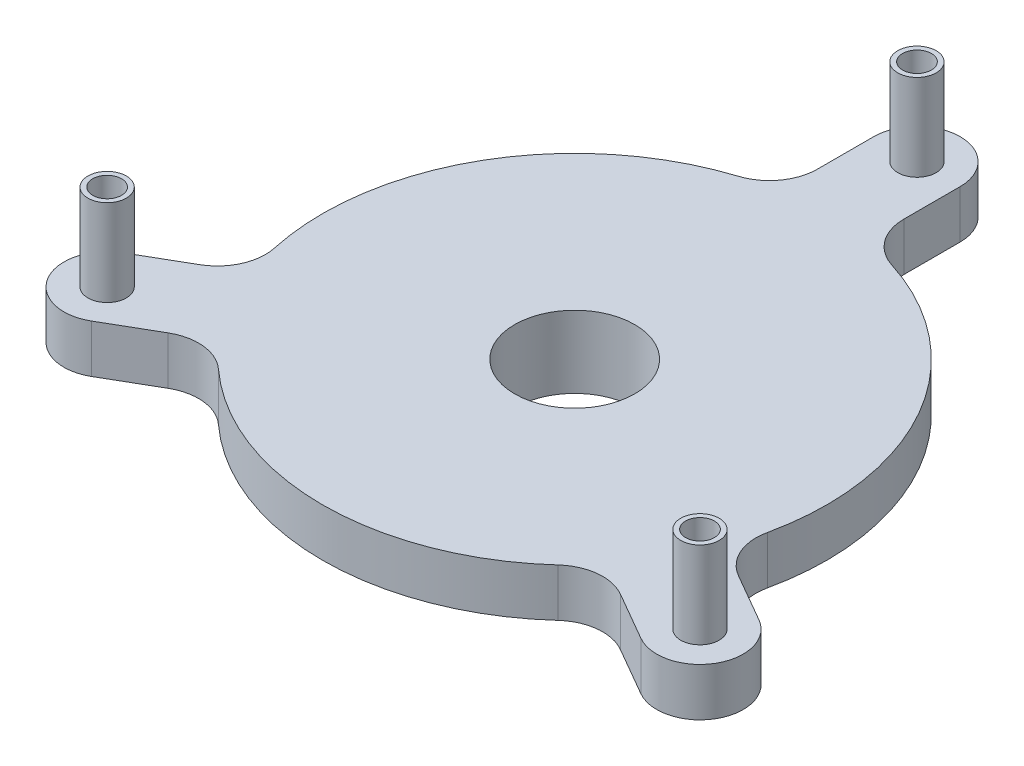
ISO-10303-21;
HEADER;
FILE_DESCRIPTION(('STEP AP214'),'2;1');
FILE_NAME('part.step','',(''),(''),'','','');
FILE_SCHEMA(('AUTOMOTIVE_DESIGN { 1 0 10303 214 1 1 1 1 }'));
ENDSEC;
DATA;
#1=APPLICATION_CONTEXT('core data for automotive mechanical design processes');
#2=APPLICATION_PROTOCOL_DEFINITION('international standard','automotive_design',2000,#1);
#3=PRODUCT_CONTEXT('',#1,'mechanical');
#4=PRODUCT('Part','Part','',(#3));
#5=PRODUCT_RELATED_PRODUCT_CATEGORY('part','',(#4));
#6=PRODUCT_DEFINITION_FORMATION('','',#4);
#7=PRODUCT_DEFINITION_CONTEXT('part definition',#1,'design');
#8=PRODUCT_DEFINITION('design','',#6,#7);
#9=PRODUCT_DEFINITION_SHAPE('','',#8);
#10=(LENGTH_UNIT() NAMED_UNIT(*) SI_UNIT(.MILLI.,.METRE.));
#11=(NAMED_UNIT(*) PLANE_ANGLE_UNIT() SI_UNIT($,.RADIAN.));
#12=(NAMED_UNIT(*) SI_UNIT($,.STERADIAN.) SOLID_ANGLE_UNIT());
#13=UNCERTAINTY_MEASURE_WITH_UNIT(LENGTH_MEASURE(1.E-05),#10,'distance_accuracy_value','');
#14=(GEOMETRIC_REPRESENTATION_CONTEXT(3) GLOBAL_UNCERTAINTY_ASSIGNED_CONTEXT((#13)) GLOBAL_UNIT_ASSIGNED_CONTEXT((#10,
#11,#12)) REPRESENTATION_CONTEXT('',''));
#15=CARTESIAN_POINT('',(0.,0.,0.));
#16=DIRECTION('',(0.,0.,1.));
#17=DIRECTION('',(1.,0.,0.));
#18=AXIS2_PLACEMENT_3D('',#15,#16,#17);
#19=CARTESIAN_POINT('',(0.,5.,0.));
#20=DIRECTION('',(0.,-1.,0.));
#21=DIRECTION('',(0.,0.,-1.));
#22=AXIS2_PLACEMENT_3D('',#19,#20,#21);
#23=CYLINDRICAL_SURFACE('',#22,12.5);
#24=CARTESIAN_POINT('',(0.,5.,0.));
#25=DIRECTION('',(0.,1.,0.));
#26=DIRECTION('',(0.,0.,1.));
#27=AXIS2_PLACEMENT_3D('',#24,#25,#26);
#28=CIRCLE('',#27,12.5);
#29=CARTESIAN_POINT('',(0.,5.,12.5));
#30=VERTEX_POINT('',#29);
#31=EDGE_CURVE('E339',#30,#30,#28,.T.);
#32=ORIENTED_EDGE('',*,*,#31,.T.);
#33=EDGE_LOOP('',(#32));
#34=FACE_BOUND('',#33,.T.);
#35=CARTESIAN_POINT('',(0.,-10.,0.));
#36=DIRECTION('',(0.,-1.,0.));
#37=DIRECTION('',(0.,0.,-1.));
#38=AXIS2_PLACEMENT_3D('',#35,#36,#37);
#39=CIRCLE('',#38,12.5);
#40=CARTESIAN_POINT('',(0.,-10.,-12.5));
#41=VERTEX_POINT('',#40);
#42=EDGE_CURVE('E595',#41,#41,#39,.T.);
#43=ORIENTED_EDGE('',*,*,#42,.T.);
#44=EDGE_LOOP('',(#43));
#45=FACE_BOUND('',#44,.T.);
#46=ADVANCED_FACE('F39',(#34,#45),#23,.F.);
#47=CARTESIAN_POINT('',(0.,5.,0.));
#48=DIRECTION('',(0.,1.,0.));
#49=DIRECTION('',(0.,0.,1.));
#50=AXIS2_PLACEMENT_3D('',#47,#48,#49);
#51=PLANE('',#50);
#52=CARTESIAN_POINT('',(0.,5.,0.));
#53=DIRECTION('',(0.,1.,0.));
#54=DIRECTION('',(0.,0.,1.));
#55=AXIS2_PLACEMENT_3D('',#52,#53,#54);
#56=CIRCLE('',#55,52.5);
#57=CARTESIAN_POINT('',(35.3345044990705,5.,38.8294062767532));
#58=VERTEX_POINT('',#57);
#59=CARTESIAN_POINT('',(-35.3345044990705,5.,38.8294062767533));
#60=VERTEX_POINT('',#59);
#61=EDGE_CURVE('E43',#58,#60,#56,.F.);
#62=ORIENTED_EDGE('',*,*,#61,.F.);
#63=CARTESIAN_POINT('',(42.0648863084173,5.,46.2254836628015));
#64=DIRECTION('',(0.,1.,0.));
#65=DIRECTION('',(0.,0.,1.));
#66=AXIS2_PLACEMENT_3D('',#63,#64,#65);
#67=CIRCLE('',#66,9.99999999999999);
#68=CARTESIAN_POINT('',(47.0648863084173,5.,37.5652296249571));
#69=VERTEX_POINT('',#68);
#70=EDGE_CURVE('E358',#58,#69,#67,.F.);
#71=ORIENTED_EDGE('',*,*,#70,.T.);
#72=DIRECTION('',(0.866025403784439,0.,0.5));
#73=VECTOR('',#72,1.);
#74=CARTESIAN_POINT('',(-4.49999999999998,5.,7.79422863405992));
#75=LINE('',#74,#73);
#76=CARTESIAN_POINT('',(57.2043100196413,5.,43.41922863406));
#77=VERTEX_POINT('',#76);
#78=EDGE_CURVE('E362',#69,#77,#75,.T.);
#79=ORIENTED_EDGE('',*,*,#78,.T.);
#80=CARTESIAN_POINT('',(61.7043100196413,5.,35.625));
#81=DIRECTION('',(0.,1.,0.));
#82=DIRECTION('',(0.,0.,1.));
#83=AXIS2_PLACEMENT_3D('',#80,#81,#82);
#84=CIRCLE('',#83,9.00000000000001);
#85=CARTESIAN_POINT('',(66.2043100196413,5.,27.8307713659401));
#86=VERTEX_POINT('',#85);
#87=EDGE_CURVE('E174',#86,#77,#84,.F.);
#88=ORIENTED_EDGE('',*,*,#87,.F.);
#89=DIRECTION('',(0.866025403784439,0.,0.5));
#90=VECTOR('',#89,1.);
#91=CARTESIAN_POINT('',(4.49999999999999,5.,-7.79422863405994));
#92=LINE('',#91,#90);
#93=CARTESIAN_POINT('',(56.0648863084173,5.,21.9767723568372));
#94=VERTEX_POINT('',#93);
#95=EDGE_CURVE('E367',#94,#86,#92,.T.);
#96=ORIENTED_EDGE('',*,*,#95,.F.);
#97=CARTESIAN_POINT('',(61.0648863084173,5.,13.3165183189928));
#98=DIRECTION('',(0.,1.,0.));
#99=DIRECTION('',(0.,0.,1.));
#100=AXIS2_PLACEMENT_3D('',#97,#98,#99);
#101=CIRCLE('',#100,9.99999999999999);
#102=CARTESIAN_POINT('',(51.2945044990705,5.,11.185875387954));
#103=VERTEX_POINT('',#102);
#104=EDGE_CURVE('E370',#103,#94,#101,.T.);
#105=ORIENTED_EDGE('',*,*,#104,.F.);
#106=CARTESIAN_POINT('',(0.,5.,0.));
#107=DIRECTION('',(0.,1.,0.));
#108=DIRECTION('',(0.,0.,1.));
#109=AXIS2_PLACEMENT_3D('',#106,#107,#108);
#110=CIRCLE('',#109,52.5);
#111=CARTESIAN_POINT('',(15.96,5.,-50.0152816647072));
#112=VERTEX_POINT('',#111);
#113=EDGE_CURVE('E373',#112,#103,#110,.F.);
#114=ORIENTED_EDGE('',*,*,#113,.F.);
#115=CARTESIAN_POINT('',(19.,5.,-59.5420019817943));
#116=DIRECTION('',(0.,1.,0.));
#117=DIRECTION('',(0.,0.,1.));
#118=AXIS2_PLACEMENT_3D('',#115,#116,#117);
#119=CIRCLE('',#118,10.);
#120=CARTESIAN_POINT('',(9.00000000000001,5.,-59.5420019817943));
#121=VERTEX_POINT('',#120);
#122=EDGE_CURVE('E376',#112,#121,#119,.F.);
#123=ORIENTED_EDGE('',*,*,#122,.T.);
#124=DIRECTION('',(0.,0.,-1.));
#125=VECTOR('',#124,1.);
#126=CARTESIAN_POINT('',(9.00000000000002,5.,0.));
#127=LINE('',#126,#125);
#128=CARTESIAN_POINT('',(9.00000000000001,5.,-71.25));
#129=VERTEX_POINT('',#128);
#130=EDGE_CURVE('E380',#121,#129,#127,.T.);
#131=ORIENTED_EDGE('',*,*,#130,.T.);
#132=CARTESIAN_POINT('',(0.,5.,-71.25));
#133=DIRECTION('',(0.,1.,0.));
#134=DIRECTION('',(0.,0.,1.));
#135=AXIS2_PLACEMENT_3D('',#132,#133,#134);
#136=CIRCLE('',#135,9.00000000000001);
#137=CARTESIAN_POINT('',(-9.00000000000001,5.,-71.25));
#138=VERTEX_POINT('',#137);
#139=EDGE_CURVE('E384',#138,#129,#136,.F.);
#140=ORIENTED_EDGE('',*,*,#139,.F.);
#141=DIRECTION('',(0.,0.,-1.));
#142=VECTOR('',#141,1.);
#143=CARTESIAN_POINT('',(-9.,5.,0.));
#144=LINE('',#143,#142);
#145=CARTESIAN_POINT('',(-9.00000000000001,5.,-59.5420019817943));
#146=VERTEX_POINT('',#145);
#147=EDGE_CURVE('E387',#146,#138,#144,.T.);
#148=ORIENTED_EDGE('',*,*,#147,.F.);
#149=CARTESIAN_POINT('',(-19.,5.,-59.5420019817943));
#150=DIRECTION('',(0.,1.,0.));
#151=DIRECTION('',(0.,0.,1.));
#152=AXIS2_PLACEMENT_3D('',#149,#150,#151);
#153=CIRCLE('',#152,10.);
#154=CARTESIAN_POINT('',(-15.96,5.,-50.0152816647072));
#155=VERTEX_POINT('',#154);
#156=EDGE_CURVE('E390',#155,#146,#153,.T.);
#157=ORIENTED_EDGE('',*,*,#156,.F.);
#158=CARTESIAN_POINT('',(0.,5.,0.));
#159=DIRECTION('',(0.,1.,0.));
#160=DIRECTION('',(0.,0.,1.));
#161=AXIS2_PLACEMENT_3D('',#158,#159,#160);
#162=CIRCLE('',#161,52.5);
#163=CARTESIAN_POINT('',(-51.2945044990705,5.,11.1858753879539));
#164=VERTEX_POINT('',#163);
#165=EDGE_CURVE('E393',#164,#155,#162,.F.);
#166=ORIENTED_EDGE('',*,*,#165,.F.);
#167=CARTESIAN_POINT('',(-61.0648863084173,5.,13.3165183189928));
#168=DIRECTION('',(0.,1.,0.));
#169=DIRECTION('',(0.,0.,1.));
#170=AXIS2_PLACEMENT_3D('',#167,#168,#169);
#171=CIRCLE('',#170,9.99999999999998);
#172=CARTESIAN_POINT('',(-56.0648863084173,5.,21.9767723568372));
#173=VERTEX_POINT('',#172);
#174=EDGE_CURVE('E396',#164,#173,#171,.F.);
#175=ORIENTED_EDGE('',*,*,#174,.T.);
#176=DIRECTION('',(-0.866025403784436,0.,0.500000000000005));
#177=VECTOR('',#176,1.);
#178=CARTESIAN_POINT('',(-4.50000000000021,5.,-7.79422863406023));
#179=LINE('',#178,#177);
#180=CARTESIAN_POINT('',(-66.2043100196413,5.,27.8307713659401));
#181=VERTEX_POINT('',#180);
#182=EDGE_CURVE('E400',#173,#181,#179,.T.);
#183=ORIENTED_EDGE('',*,*,#182,.T.);
#184=CARTESIAN_POINT('',(-61.7043100196412,5.,35.625));
#185=DIRECTION('',(0.,1.,0.));
#186=DIRECTION('',(0.,0.,1.));
#187=AXIS2_PLACEMENT_3D('',#184,#185,#186);
#188=CIRCLE('',#187,9.00000000000001);
#189=CARTESIAN_POINT('',(-57.2043100196413,5.,43.41922863406));
#190=VERTEX_POINT('',#189);
#191=EDGE_CURVE('E404',#190,#181,#188,.F.);
#192=ORIENTED_EDGE('',*,*,#191,.F.);
#193=DIRECTION('',(-0.866025403784437,0.,0.500000000000003));
#194=VECTOR('',#193,1.);
#195=CARTESIAN_POINT('',(4.49999999999993,5.,7.79422863405976));
#196=LINE('',#195,#194);
#197=CARTESIAN_POINT('',(-47.0648863084173,5.,37.5652296249571));
#198=VERTEX_POINT('',#197);
#199=EDGE_CURVE('E407',#198,#190,#196,.T.);
#200=ORIENTED_EDGE('',*,*,#199,.F.);
#201=CARTESIAN_POINT('',(-42.0648863084173,5.,46.2254836628015));
#202=DIRECTION('',(0.,1.,0.));
#203=DIRECTION('',(0.,0.,1.));
#204=AXIS2_PLACEMENT_3D('',#201,#202,#203);
#205=CIRCLE('',#204,9.99999999999999);
#206=EDGE_CURVE('E409',#60,#198,#205,.T.);
#207=ORIENTED_EDGE('',*,*,#206,.F.);
#208=EDGE_LOOP('',(#62,#71,#79,#88,#96,#105,#114,#123,#131,#140,#148,#157,#166,#175,#183,#192,
#200,#207));
#209=FACE_BOUND('',#208,.T.);
#210=CARTESIAN_POINT('',(-61.7043100196412,5.,35.625));
#211=DIRECTION('',(0.,1.,0.));
#212=DIRECTION('',(0.,0.,1.));
#213=AXIS2_PLACEMENT_3D('',#210,#211,#212);
#214=CIRCLE('',#213,4.);
#215=CARTESIAN_POINT('',(-61.7043100196412,5.,39.625));
#216=VERTEX_POINT('',#215);
#217=EDGE_CURVE('E310',#216,#216,#214,.T.);
#218=ORIENTED_EDGE('',*,*,#217,.F.);
#219=EDGE_LOOP('',(#218));
#220=FACE_BOUND('',#219,.T.);
#221=CARTESIAN_POINT('',(61.7043100196413,5.,35.625));
#222=DIRECTION('',(0.,1.,0.));
#223=DIRECTION('',(0.,0.,1.));
#224=AXIS2_PLACEMENT_3D('',#221,#222,#223);
#225=CIRCLE('',#224,3.99999999999999);
#226=CARTESIAN_POINT('',(61.7043100196413,5.,39.625));
#227=VERTEX_POINT('',#226);
#228=EDGE_CURVE('E322',#227,#227,#225,.T.);
#229=ORIENTED_EDGE('',*,*,#228,.F.);
#230=EDGE_LOOP('',(#229));
#231=FACE_BOUND('',#230,.T.);
#232=CARTESIAN_POINT('',(0.,5.,-71.25));
#233=DIRECTION('',(0.,1.,0.));
#234=DIRECTION('',(0.,0.,1.));
#235=AXIS2_PLACEMENT_3D('',#232,#233,#234);
#236=CIRCLE('',#235,4.);
#237=CARTESIAN_POINT('',(0.,5.,-67.25));
#238=VERTEX_POINT('',#237);
#239=EDGE_CURVE('E334',#238,#238,#236,.T.);
#240=ORIENTED_EDGE('',*,*,#239,.F.);
#241=EDGE_LOOP('',(#240));
#242=FACE_BOUND('',#241,.T.);
#243=ORIENTED_EDGE('',*,*,#31,.F.);
#244=EDGE_LOOP('',(#243));
#245=FACE_BOUND('',#244,.T.);
#246=ADVANCED_FACE('F41',(#209,#220,#231,#242,#245),#51,.T.);
#247=CARTESIAN_POINT('',(0.,23.,-71.25));
#248=DIRECTION('',(0.,1.,0.));
#249=DIRECTION('',(0.,0.,1.));
#250=AXIS2_PLACEMENT_3D('',#247,#248,#249);
#251=PLANE('',#250);
#252=CARTESIAN_POINT('',(0.,23.,-71.25));
#253=DIRECTION('',(0.,1.,0.));
#254=DIRECTION('',(0.,0.,1.));
#255=AXIS2_PLACEMENT_3D('',#252,#253,#254);
#256=CIRCLE('',#255,4.);
#257=CARTESIAN_POINT('',(0.,23.,-67.25));
#258=VERTEX_POINT('',#257);
#259=EDGE_CURVE('E335',#258,#258,#256,.T.);
#260=ORIENTED_EDGE('',*,*,#259,.T.);
#261=EDGE_LOOP('',(#260));
#262=FACE_BOUND('',#261,.T.);
#263=CARTESIAN_POINT('',(0.,23.,-71.25));
#264=DIRECTION('',(0.,1.,0.));
#265=DIRECTION('',(0.,0.,1.));
#266=AXIS2_PLACEMENT_3D('',#263,#264,#265);
#267=CIRCLE('',#266,3.);
#268=CARTESIAN_POINT('',(0.,23.,-68.25));
#269=VERTEX_POINT('',#268);
#270=EDGE_CURVE('E327',#269,#269,#267,.T.);
#271=ORIENTED_EDGE('',*,*,#270,.F.);
#272=EDGE_LOOP('',(#271));
#273=FACE_BOUND('',#272,.T.);
#274=ADVANCED_FACE('F455',(#262,#273),#251,.T.);
#275=CARTESIAN_POINT('',(0.,23.,-71.25));
#276=DIRECTION('',(0.,-1.,0.));
#277=DIRECTION('',(0.,0.,-1.));
#278=AXIS2_PLACEMENT_3D('',#275,#276,#277);
#279=CYLINDRICAL_SURFACE('',#278,4.);
#280=ORIENTED_EDGE('',*,*,#259,.F.);
#281=EDGE_LOOP('',(#280));
#282=FACE_BOUND('',#281,.T.);
#283=ORIENTED_EDGE('',*,*,#239,.T.);
#284=EDGE_LOOP('',(#283));
#285=FACE_BOUND('',#284,.T.);
#286=ADVANCED_FACE('F460',(#282,#285),#279,.T.);
#287=CARTESIAN_POINT('',(0.,23.,-71.25));
#288=DIRECTION('',(0.,-1.,0.));
#289=DIRECTION('',(0.,0.,-1.));
#290=AXIS2_PLACEMENT_3D('',#287,#288,#289);
#291=CYLINDRICAL_SURFACE('',#290,3.);
#292=ORIENTED_EDGE('',*,*,#270,.T.);
#293=EDGE_LOOP('',(#292));
#294=FACE_BOUND('',#293,.T.);
#295=CARTESIAN_POINT('',(0.,5.,-71.25));
#296=DIRECTION('',(0.,1.,0.));
#297=DIRECTION('',(0.,0.,1.));
#298=AXIS2_PLACEMENT_3D('',#295,#296,#297);
#299=CIRCLE('',#298,3.);
#300=CARTESIAN_POINT('',(0.,5.,-68.25));
#301=VERTEX_POINT('',#300);
#302=EDGE_CURVE('E346',#301,#301,#299,.F.);
#303=ORIENTED_EDGE('',*,*,#302,.T.);
#304=EDGE_LOOP('',(#303));
#305=FACE_BOUND('',#304,.T.);
#306=ADVANCED_FACE('F463',(#294,#305),#291,.F.);
#307=ORIENTED_EDGE('',*,*,#302,.F.);
#308=EDGE_LOOP('',(#307));
#309=FACE_BOUND('',#308,.T.);
#310=ADVANCED_FACE('F457',(#309),#51,.T.);
#311=CARTESIAN_POINT('',(61.7043100196413,23.,35.625));
#312=DIRECTION('',(0.,1.,0.));
#313=DIRECTION('',(0.,0.,1.));
#314=AXIS2_PLACEMENT_3D('',#311,#312,#313);
#315=PLANE('',#314);
#316=CARTESIAN_POINT('',(61.7043100196413,23.,35.625));
#317=DIRECTION('',(0.,1.,0.));
#318=DIRECTION('',(0.,0.,1.));
#319=AXIS2_PLACEMENT_3D('',#316,#317,#318);
#320=CIRCLE('',#319,3.99999999999999);
#321=CARTESIAN_POINT('',(61.7043100196413,23.,39.625));
#322=VERTEX_POINT('',#321);
#323=EDGE_CURVE('E323',#322,#322,#320,.T.);
#324=ORIENTED_EDGE('',*,*,#323,.T.);
#325=EDGE_LOOP('',(#324));
#326=FACE_BOUND('',#325,.T.);
#327=CARTESIAN_POINT('',(61.7043100196413,23.,35.625));
#328=DIRECTION('',(0.,1.,0.));
#329=DIRECTION('',(0.,0.,1.));
#330=AXIS2_PLACEMENT_3D('',#327,#328,#329);
#331=CIRCLE('',#330,3.00000000000012);
#332=CARTESIAN_POINT('',(61.7043100196413,23.,38.6250000000001));
#333=VERTEX_POINT('',#332);
#334=EDGE_CURVE('E315',#333,#333,#331,.T.);
#335=ORIENTED_EDGE('',*,*,#334,.F.);
#336=EDGE_LOOP('',(#335));
#337=FACE_BOUND('',#336,.T.);
#338=ADVANCED_FACE('F475',(#326,#337),#315,.T.);
#339=CARTESIAN_POINT('',(61.7043100196413,23.,35.625));
#340=DIRECTION('',(0.,-1.,0.));
#341=DIRECTION('',(0.,0.,-1.));
#342=AXIS2_PLACEMENT_3D('',#339,#340,#341);
#343=CYLINDRICAL_SURFACE('',#342,3.99999999999999);
#344=ORIENTED_EDGE('',*,*,#323,.F.);
#345=EDGE_LOOP('',(#344));
#346=FACE_BOUND('',#345,.T.);
#347=ORIENTED_EDGE('',*,*,#228,.T.);
#348=EDGE_LOOP('',(#347));
#349=FACE_BOUND('',#348,.T.);
#350=ADVANCED_FACE('F471',(#346,#349),#343,.T.);
#351=CARTESIAN_POINT('',(61.7043100196413,23.,35.625));
#352=DIRECTION('',(0.,-1.,0.));
#353=DIRECTION('',(0.,0.,-1.));
#354=AXIS2_PLACEMENT_3D('',#351,#352,#353);
#355=CYLINDRICAL_SURFACE('',#354,3.00000000000012);
#356=ORIENTED_EDGE('',*,*,#334,.T.);
#357=EDGE_LOOP('',(#356));
#358=FACE_BOUND('',#357,.T.);
#359=CARTESIAN_POINT('',(61.7043100196413,5.,35.625));
#360=DIRECTION('',(0.,1.,0.));
#361=DIRECTION('',(0.,0.,1.));
#362=AXIS2_PLACEMENT_3D('',#359,#360,#361);
#363=CIRCLE('',#362,3.00000000000012);
#364=CARTESIAN_POINT('',(61.7043100196413,5.,38.6250000000001));
#365=VERTEX_POINT('',#364);
#366=EDGE_CURVE('E350',#365,#365,#363,.F.);
#367=ORIENTED_EDGE('',*,*,#366,.T.);
#368=EDGE_LOOP('',(#367));
#369=FACE_BOUND('',#368,.T.);
#370=ADVANCED_FACE('F474',(#358,#369),#355,.F.);
#371=ORIENTED_EDGE('',*,*,#366,.F.);
#372=EDGE_LOOP('',(#371));
#373=FACE_BOUND('',#372,.T.);
#374=ADVANCED_FACE('F482',(#373),#51,.T.);
#375=CARTESIAN_POINT('',(-61.7043100196412,23.,35.625));
#376=DIRECTION('',(0.,1.,0.));
#377=DIRECTION('',(0.,0.,1.));
#378=AXIS2_PLACEMENT_3D('',#375,#376,#377);
#379=PLANE('',#378);
#380=CARTESIAN_POINT('',(-61.7043100196412,23.,35.625));
#381=DIRECTION('',(0.,1.,0.));
#382=DIRECTION('',(0.,0.,1.));
#383=AXIS2_PLACEMENT_3D('',#380,#381,#382);
#384=CIRCLE('',#383,4.);
#385=CARTESIAN_POINT('',(-61.7043100196412,23.,39.625));
#386=VERTEX_POINT('',#385);
#387=EDGE_CURVE('E311',#386,#386,#384,.T.);
#388=ORIENTED_EDGE('',*,*,#387,.T.);
#389=EDGE_LOOP('',(#388));
#390=FACE_BOUND('',#389,.T.);
#391=CARTESIAN_POINT('',(-61.7043100196412,23.,35.625));
#392=DIRECTION('',(0.,1.,0.));
#393=DIRECTION('',(0.,0.,1.));
#394=AXIS2_PLACEMENT_3D('',#391,#392,#393);
#395=CIRCLE('',#394,3.);
#396=CARTESIAN_POINT('',(-61.7043100196412,23.,38.625));
#397=VERTEX_POINT('',#396);
#398=EDGE_CURVE('E306',#397,#397,#395,.T.);
#399=ORIENTED_EDGE('',*,*,#398,.F.);
#400=EDGE_LOOP('',(#399));
#401=FACE_BOUND('',#400,.T.);
#402=ADVANCED_FACE('F488',(#390,#401),#379,.T.);
#403=CARTESIAN_POINT('',(-61.7043100196412,23.,35.625));
#404=DIRECTION('',(0.,-1.,0.));
#405=DIRECTION('',(0.,0.,-1.));
#406=AXIS2_PLACEMENT_3D('',#403,#404,#405);
#407=CYLINDRICAL_SURFACE('',#406,4.);
#408=ORIENTED_EDGE('',*,*,#387,.F.);
#409=EDGE_LOOP('',(#408));
#410=FACE_BOUND('',#409,.T.);
#411=ORIENTED_EDGE('',*,*,#217,.T.);
#412=EDGE_LOOP('',(#411));
#413=FACE_BOUND('',#412,.T.);
#414=ADVANCED_FACE('F484',(#410,#413),#407,.T.);
#415=CARTESIAN_POINT('',(-61.7043100196412,23.,35.625));
#416=DIRECTION('',(0.,-1.,0.));
#417=DIRECTION('',(0.,0.,-1.));
#418=AXIS2_PLACEMENT_3D('',#415,#416,#417);
#419=CYLINDRICAL_SURFACE('',#418,3.);
#420=ORIENTED_EDGE('',*,*,#398,.T.);
#421=EDGE_LOOP('',(#420));
#422=FACE_BOUND('',#421,.T.);
#423=CARTESIAN_POINT('',(-61.7043100196412,5.,35.625));
#424=DIRECTION('',(0.,1.,0.));
#425=DIRECTION('',(0.,0.,1.));
#426=AXIS2_PLACEMENT_3D('',#423,#424,#425);
#427=CIRCLE('',#426,3.);
#428=CARTESIAN_POINT('',(-61.7043100196412,5.,38.625));
#429=VERTEX_POINT('',#428);
#430=EDGE_CURVE('E354',#429,#429,#427,.F.);
#431=ORIENTED_EDGE('',*,*,#430,.T.);
#432=EDGE_LOOP('',(#431));
#433=FACE_BOUND('',#432,.T.);
#434=ADVANCED_FACE('F487',(#422,#433),#419,.F.);
#435=ORIENTED_EDGE('',*,*,#430,.F.);
#436=EDGE_LOOP('',(#435));
#437=FACE_BOUND('',#436,.T.);
#438=ADVANCED_FACE('F456',(#437),#51,.T.);
#439=CARTESIAN_POINT('',(0.,23.,0.));
#440=DIRECTION('',(0.,-1.,0.));
#441=DIRECTION('',(0.,0.,-1.));
#442=AXIS2_PLACEMENT_3D('',#439,#440,#441);
#443=CYLINDRICAL_SURFACE('',#442,52.5);
#444=DIRECTION('',(0.,-1.,0.));
#445=VECTOR('',#444,1.);
#446=CARTESIAN_POINT('',(35.3345044990705,23.,38.8294062767532));
#447=LINE('',#446,#445);
#448=CARTESIAN_POINT('',(35.3345044990705,-5.00000000000006,38.8294062767532));
#449=VERTEX_POINT('',#448);
#450=EDGE_CURVE('E186',#58,#449,#447,.T.);
#451=ORIENTED_EDGE('',*,*,#450,.F.);
#452=ORIENTED_EDGE('',*,*,#61,.T.);
#453=DIRECTION('',(0.,-1.,0.));
#454=VECTOR('',#453,1.);
#455=CARTESIAN_POINT('',(-35.3345044990705,23.,38.8294062767533));
#456=LINE('',#455,#454);
#457=CARTESIAN_POINT('',(-35.3345044990705,-5.00000000000006,38.8294062767533));
#458=VERTEX_POINT('',#457);
#459=EDGE_CURVE('E303',#60,#458,#456,.T.);
#460=ORIENTED_EDGE('',*,*,#459,.T.);
#461=CARTESIAN_POINT('',(0.,-5.,0.));
#462=DIRECTION('',(0.,-1.,0.));
#463=DIRECTION('',(0.,0.,-1.));
#464=AXIS2_PLACEMENT_3D('',#461,#462,#463);
#465=CIRCLE('',#464,52.5);
#466=EDGE_CURVE('E203',#449,#458,#465,.T.);
#467=ORIENTED_EDGE('',*,*,#466,.F.);
#468=EDGE_LOOP('',(#451,#452,#460,#467));
#469=FACE_BOUND('',#468,.T.);
#470=ADVANCED_FACE('F435',(#469),#443,.T.);
#471=CARTESIAN_POINT('',(-42.0648863084173,23.,46.2254836628015));
#472=DIRECTION('',(0.,-1.,0.));
#473=DIRECTION('',(0.,0.,-1.));
#474=AXIS2_PLACEMENT_3D('',#471,#472,#473);
#475=CYLINDRICAL_SURFACE('',#474,9.99999999999999);
#476=ORIENTED_EDGE('',*,*,#459,.F.);
#477=ORIENTED_EDGE('',*,*,#206,.T.);
#478=DIRECTION('',(0.,-1.,0.));
#479=VECTOR('',#478,1.);
#480=CARTESIAN_POINT('',(-47.0648863084173,23.,37.5652296249571));
#481=LINE('',#480,#479);
#482=CARTESIAN_POINT('',(-47.0648863084173,-5.00000000000006,37.5652296249571));
#483=VERTEX_POINT('',#482);
#484=EDGE_CURVE('E300',#198,#483,#481,.T.);
#485=ORIENTED_EDGE('',*,*,#484,.T.);
#486=CARTESIAN_POINT('',(-42.0648863084173,-5.,46.2254836628015));
#487=DIRECTION('',(0.,-1.,0.));
#488=DIRECTION('',(0.,0.,-1.));
#489=AXIS2_PLACEMENT_3D('',#486,#487,#488);
#490=CIRCLE('',#489,9.99999999999999);
#491=EDGE_CURVE('E236',#483,#458,#490,.T.);
#492=ORIENTED_EDGE('',*,*,#491,.T.);
#493=EDGE_LOOP('',(#476,#477,#485,#492));
#494=FACE_BOUND('',#493,.T.);
#495=ADVANCED_FACE('F415',(#494),#475,.F.);
#496=CARTESIAN_POINT('',(4.49999999999993,23.,7.79422863405976));
#497=DIRECTION('',(-0.500000000000003,0.,-0.866025403784437));
#498=DIRECTION('',(-0.866025403784437,0.,0.500000000000003));
#499=AXIS2_PLACEMENT_3D('',#496,#497,#498);
#500=PLANE('',#499);
#501=ORIENTED_EDGE('',*,*,#484,.F.);
#502=ORIENTED_EDGE('',*,*,#199,.T.);
#503=DIRECTION('',(0.,-1.,0.));
#504=VECTOR('',#503,1.);
#505=CARTESIAN_POINT('',(-57.2043100196413,23.,43.41922863406));
#506=LINE('',#505,#504);
#507=CARTESIAN_POINT('',(-57.2043100196413,-5.00000000000006,43.41922863406));
#508=VERTEX_POINT('',#507);
#509=EDGE_CURVE('E297',#190,#508,#506,.T.);
#510=ORIENTED_EDGE('',*,*,#509,.T.);
#511=DIRECTION('',(-0.866025403784437,0.,0.500000000000003));
#512=VECTOR('',#511,1.);
#513=CARTESIAN_POINT('',(-47.0648863084173,-5.,37.5652296249571));
#514=LINE('',#513,#512);
#515=EDGE_CURVE('E244',#483,#508,#514,.T.);
#516=ORIENTED_EDGE('',*,*,#515,.F.);
#517=EDGE_LOOP('',(#501,#502,#510,#516));
#518=FACE_BOUND('',#517,.T.);
#519=ADVANCED_FACE('F420',(#518),#500,.F.);
#520=CARTESIAN_POINT('',(-61.7043100196412,23.,35.625));
#521=DIRECTION('',(0.,-1.,0.));
#522=DIRECTION('',(0.,0.,-1.));
#523=AXIS2_PLACEMENT_3D('',#520,#521,#522);
#524=CYLINDRICAL_SURFACE('',#523,9.00000000000001);
#525=ORIENTED_EDGE('',*,*,#509,.F.);
#526=ORIENTED_EDGE('',*,*,#191,.T.);
#527=DIRECTION('',(0.,-1.,0.));
#528=VECTOR('',#527,1.);
#529=CARTESIAN_POINT('',(-66.2043100196413,23.,27.8307713659401));
#530=LINE('',#529,#528);
#531=CARTESIAN_POINT('',(-66.2043100196413,-5.00000000000006,27.8307713659401));
#532=VERTEX_POINT('',#531);
#533=EDGE_CURVE('E294',#181,#532,#530,.T.);
#534=ORIENTED_EDGE('',*,*,#533,.T.);
#535=CARTESIAN_POINT('',(-61.7043100196412,-5.,35.625));
#536=DIRECTION('',(0.,-1.,0.));
#537=DIRECTION('',(0.,0.,-1.));
#538=AXIS2_PLACEMENT_3D('',#535,#536,#537);
#539=CIRCLE('',#538,9.00000000000002);
#540=EDGE_CURVE('E240',#508,#532,#539,.T.);
#541=ORIENTED_EDGE('',*,*,#540,.F.);
#542=EDGE_LOOP('',(#525,#526,#534,#541));
#543=FACE_BOUND('',#542,.T.);
#544=ADVANCED_FACE('F427',(#543),#524,.T.);
#545=CARTESIAN_POINT('',(-4.50000000000022,23.,-7.79422863406023));
#546=DIRECTION('',(-0.500000000000005,0.,-0.866025403784436));
#547=DIRECTION('',(-0.866025403784436,0.,0.500000000000005));
#548=AXIS2_PLACEMENT_3D('',#545,#546,#547);
#549=PLANE('',#548);
#550=DIRECTION('',(0.,-1.,0.));
#551=VECTOR('',#550,1.);
#552=CARTESIAN_POINT('',(-56.0648863084173,23.,21.9767723568372));
#553=LINE('',#552,#551);
#554=CARTESIAN_POINT('',(-56.0648863084173,-5.00000000000006,21.9767723568372));
#555=VERTEX_POINT('',#554);
#556=EDGE_CURVE('E291',#173,#555,#553,.T.);
#557=ORIENTED_EDGE('',*,*,#556,.T.);
#558=DIRECTION('',(0.866025403784438,0.,-0.500000000000002));
#559=VECTOR('',#558,1.);
#560=CARTESIAN_POINT('',(-66.2043100196413,-5.,27.8307713659401));
#561=LINE('',#560,#559);
#562=EDGE_CURVE('E232',#532,#555,#561,.T.);
#563=ORIENTED_EDGE('',*,*,#562,.F.);
#564=ORIENTED_EDGE('',*,*,#533,.F.);
#565=ORIENTED_EDGE('',*,*,#182,.F.);
#566=EDGE_LOOP('',(#557,#563,#564,#565));
#567=FACE_BOUND('',#566,.T.);
#568=ADVANCED_FACE('F431',(#567),#549,.T.);
#569=CARTESIAN_POINT('',(-61.0648863084173,23.,13.3165183189928));
#570=DIRECTION('',(0.,-1.,0.));
#571=DIRECTION('',(0.,0.,-1.));
#572=AXIS2_PLACEMENT_3D('',#569,#570,#571);
#573=CYLINDRICAL_SURFACE('',#572,9.99999999999998);
#574=DIRECTION('',(0.,-1.,0.));
#575=VECTOR('',#574,1.);
#576=CARTESIAN_POINT('',(-51.2945044990705,23.,11.1858753879539));
#577=LINE('',#576,#575);
#578=CARTESIAN_POINT('',(-51.2945044990705,-5.00000000000006,11.1858753879539));
#579=VERTEX_POINT('',#578);
#580=EDGE_CURVE('E288',#164,#579,#577,.T.);
#581=ORIENTED_EDGE('',*,*,#580,.T.);
#582=CARTESIAN_POINT('',(-61.0648863084173,-5.,13.3165183189928));
#583=DIRECTION('',(0.,-1.,0.));
#584=DIRECTION('',(0.,0.,-1.));
#585=AXIS2_PLACEMENT_3D('',#582,#583,#584);
#586=CIRCLE('',#585,9.99999999999999);
#587=EDGE_CURVE('E228',#579,#555,#586,.T.);
#588=ORIENTED_EDGE('',*,*,#587,.T.);
#589=ORIENTED_EDGE('',*,*,#556,.F.);
#590=ORIENTED_EDGE('',*,*,#174,.F.);
#591=EDGE_LOOP('',(#581,#588,#589,#590));
#592=FACE_BOUND('',#591,.T.);
#593=ADVANCED_FACE('F506',(#592),#573,.F.);
#594=CARTESIAN_POINT('',(0.,23.,0.));
#595=DIRECTION('',(0.,-1.,0.));
#596=DIRECTION('',(0.,0.,-1.));
#597=AXIS2_PLACEMENT_3D('',#594,#595,#596);
#598=CYLINDRICAL_SURFACE('',#597,52.5);
#599=ORIENTED_EDGE('',*,*,#580,.F.);
#600=ORIENTED_EDGE('',*,*,#165,.T.);
#601=DIRECTION('',(0.,-1.,0.));
#602=VECTOR('',#601,1.);
#603=CARTESIAN_POINT('',(-15.96,23.,-50.0152816647072));
#604=LINE('',#603,#602);
#605=CARTESIAN_POINT('',(-15.96,-5.00000000000006,-50.0152816647072));
#606=VERTEX_POINT('',#605);
#607=EDGE_CURVE('E285',#155,#606,#604,.T.);
#608=ORIENTED_EDGE('',*,*,#607,.T.);
#609=CARTESIAN_POINT('',(0.,-5.,0.));
#610=DIRECTION('',(0.,-1.,0.));
#611=DIRECTION('',(0.,0.,-1.));
#612=AXIS2_PLACEMENT_3D('',#609,#610,#611);
#613=CIRCLE('',#612,52.5);
#614=EDGE_CURVE('E224',#579,#606,#613,.T.);
#615=ORIENTED_EDGE('',*,*,#614,.F.);
#616=EDGE_LOOP('',(#599,#600,#608,#615));
#617=FACE_BOUND('',#616,.T.);
#618=ADVANCED_FACE('F509',(#617),#598,.T.);
#619=CARTESIAN_POINT('',(-19.,23.,-59.5420019817943));
#620=DIRECTION('',(0.,-1.,0.));
#621=DIRECTION('',(0.,0.,-1.));
#622=AXIS2_PLACEMENT_3D('',#619,#620,#621);
#623=CYLINDRICAL_SURFACE('',#622,10.);
#624=ORIENTED_EDGE('',*,*,#607,.F.);
#625=ORIENTED_EDGE('',*,*,#156,.T.);
#626=DIRECTION('',(0.,-1.,0.));
#627=VECTOR('',#626,1.);
#628=CARTESIAN_POINT('',(-9.00000000000001,23.,-59.5420019817943));
#629=LINE('',#628,#627);
#630=CARTESIAN_POINT('',(-9.00000000000001,-5.00000000000006,-59.5420019817943));
#631=VERTEX_POINT('',#630);
#632=EDGE_CURVE('E282',#146,#631,#629,.T.);
#633=ORIENTED_EDGE('',*,*,#632,.T.);
#634=CARTESIAN_POINT('',(-19.,-5.,-59.5420019817943));
#635=DIRECTION('',(0.,-1.,0.));
#636=DIRECTION('',(0.,0.,-1.));
#637=AXIS2_PLACEMENT_3D('',#634,#635,#636);
#638=CIRCLE('',#637,10.);
#639=EDGE_CURVE('E212',#631,#606,#638,.T.);
#640=ORIENTED_EDGE('',*,*,#639,.T.);
#641=EDGE_LOOP('',(#624,#625,#633,#640));
#642=FACE_BOUND('',#641,.T.);
#643=ADVANCED_FACE('F513',(#642),#623,.F.);
#644=CARTESIAN_POINT('',(-9.,23.,0.));
#645=DIRECTION('',(1.,0.,0.));
#646=DIRECTION('',(0.,0.,-1.));
#647=AXIS2_PLACEMENT_3D('',#644,#645,#646);
#648=PLANE('',#647);
#649=ORIENTED_EDGE('',*,*,#632,.F.);
#650=ORIENTED_EDGE('',*,*,#147,.T.);
#651=DIRECTION('',(0.,-1.,0.));
#652=VECTOR('',#651,1.);
#653=CARTESIAN_POINT('',(-9.00000000000001,23.,-71.25));
#654=LINE('',#653,#652);
#655=CARTESIAN_POINT('',(-9.00000000000001,-5.00000000000006,-71.25));
#656=VERTEX_POINT('',#655);
#657=EDGE_CURVE('E279',#138,#656,#654,.T.);
#658=ORIENTED_EDGE('',*,*,#657,.T.);
#659=DIRECTION('',(0.,0.,-1.));
#660=VECTOR('',#659,1.);
#661=CARTESIAN_POINT('',(-9.00000000000001,-5.,-59.5420019817943));
#662=LINE('',#661,#660);
#663=EDGE_CURVE('E220',#631,#656,#662,.T.);
#664=ORIENTED_EDGE('',*,*,#663,.F.);
#665=EDGE_LOOP('',(#649,#650,#658,#664));
#666=FACE_BOUND('',#665,.T.);
#667=ADVANCED_FACE('F517',(#666),#648,.F.);
#668=CARTESIAN_POINT('',(0.,23.,-71.25));
#669=DIRECTION('',(0.,-1.,0.));
#670=DIRECTION('',(0.,0.,-1.));
#671=AXIS2_PLACEMENT_3D('',#668,#669,#670);
#672=CYLINDRICAL_SURFACE('',#671,9.00000000000001);
#673=ORIENTED_EDGE('',*,*,#657,.F.);
#674=ORIENTED_EDGE('',*,*,#139,.T.);
#675=DIRECTION('',(0.,-1.,0.));
#676=VECTOR('',#675,1.);
#677=CARTESIAN_POINT('',(9.00000000000001,23.,-71.25));
#678=LINE('',#677,#676);
#679=CARTESIAN_POINT('',(9.00000000000001,-5.00000000000006,-71.25));
#680=VERTEX_POINT('',#679);
#681=EDGE_CURVE('E276',#129,#680,#678,.T.);
#682=ORIENTED_EDGE('',*,*,#681,.T.);
#683=CARTESIAN_POINT('',(0.,-5.,-71.25));
#684=DIRECTION('',(0.,-1.,0.));
#685=DIRECTION('',(0.,0.,-1.));
#686=AXIS2_PLACEMENT_3D('',#683,#684,#685);
#687=CIRCLE('',#686,9.00000000000001);
#688=EDGE_CURVE('E216',#656,#680,#687,.T.);
#689=ORIENTED_EDGE('',*,*,#688,.F.);
#690=EDGE_LOOP('',(#673,#674,#682,#689));
#691=FACE_BOUND('',#690,.T.);
#692=ADVANCED_FACE('F521',(#691),#672,.T.);
#693=CARTESIAN_POINT('',(9.00000000000002,23.,0.));
#694=DIRECTION('',(1.,0.,0.));
#695=DIRECTION('',(0.,0.,-1.));
#696=AXIS2_PLACEMENT_3D('',#693,#694,#695);
#697=PLANE('',#696);
#698=DIRECTION('',(0.,-1.,0.));
#699=VECTOR('',#698,1.);
#700=CARTESIAN_POINT('',(9.00000000000001,23.,-59.5420019817943));
#701=LINE('',#700,#699);
#702=CARTESIAN_POINT('',(9.00000000000001,-5.00000000000006,-59.5420019817943));
#703=VERTEX_POINT('',#702);
#704=EDGE_CURVE('E273',#121,#703,#701,.T.);
#705=ORIENTED_EDGE('',*,*,#704,.T.);
#706=DIRECTION('',(0.,0.,1.));
#707=VECTOR('',#706,1.);
#708=CARTESIAN_POINT('',(9.00000000000001,-5.,-71.25));
#709=LINE('',#708,#707);
#710=EDGE_CURVE('E208',#680,#703,#709,.T.);
#711=ORIENTED_EDGE('',*,*,#710,.F.);
#712=ORIENTED_EDGE('',*,*,#681,.F.);
#713=ORIENTED_EDGE('',*,*,#130,.F.);
#714=EDGE_LOOP('',(#705,#711,#712,#713));
#715=FACE_BOUND('',#714,.T.);
#716=ADVANCED_FACE('F525',(#715),#697,.T.);
#717=CARTESIAN_POINT('',(19.,23.,-59.5420019817943));
#718=DIRECTION('',(0.,-1.,0.));
#719=DIRECTION('',(0.,0.,-1.));
#720=AXIS2_PLACEMENT_3D('',#717,#718,#719);
#721=CYLINDRICAL_SURFACE('',#720,10.);
#722=DIRECTION('',(0.,-1.,0.));
#723=VECTOR('',#722,1.);
#724=CARTESIAN_POINT('',(15.96,23.,-50.0152816647072));
#725=LINE('',#724,#723);
#726=CARTESIAN_POINT('',(15.96,-5.00000000000006,-50.0152816647072));
#727=VERTEX_POINT('',#726);
#728=EDGE_CURVE('E270',#112,#727,#725,.T.);
#729=ORIENTED_EDGE('',*,*,#728,.T.);
#730=CARTESIAN_POINT('',(19.,-5.,-59.5420019817943));
#731=DIRECTION('',(0.,-1.,0.));
#732=DIRECTION('',(0.,0.,-1.));
#733=AXIS2_PLACEMENT_3D('',#730,#731,#732);
#734=CIRCLE('',#733,9.99999999999999);
#735=EDGE_CURVE('E204',#727,#703,#734,.T.);
#736=ORIENTED_EDGE('',*,*,#735,.T.);
#737=ORIENTED_EDGE('',*,*,#704,.F.);
#738=ORIENTED_EDGE('',*,*,#122,.F.);
#739=EDGE_LOOP('',(#729,#736,#737,#738));
#740=FACE_BOUND('',#739,.T.);
#741=ADVANCED_FACE('F529',(#740),#721,.F.);
#742=CARTESIAN_POINT('',(0.,23.,0.));
#743=DIRECTION('',(0.,-1.,0.));
#744=DIRECTION('',(0.,0.,-1.));
#745=AXIS2_PLACEMENT_3D('',#742,#743,#744);
#746=CYLINDRICAL_SURFACE('',#745,52.5);
#747=ORIENTED_EDGE('',*,*,#728,.F.);
#748=ORIENTED_EDGE('',*,*,#113,.T.);
#749=DIRECTION('',(0.,-1.,0.));
#750=VECTOR('',#749,1.);
#751=CARTESIAN_POINT('',(51.2945044990705,23.,11.185875387954));
#752=LINE('',#751,#750);
#753=CARTESIAN_POINT('',(51.2945044990705,-5.00000000000006,11.185875387954));
#754=VERTEX_POINT('',#753);
#755=EDGE_CURVE('E267',#103,#754,#752,.T.);
#756=ORIENTED_EDGE('',*,*,#755,.T.);
#757=CARTESIAN_POINT('',(0.,-5.,0.));
#758=DIRECTION('',(0.,-1.,0.));
#759=DIRECTION('',(0.,0.,-1.));
#760=AXIS2_PLACEMENT_3D('',#757,#758,#759);
#761=CIRCLE('',#760,52.5);
#762=EDGE_CURVE('E195',#727,#754,#761,.T.);
#763=ORIENTED_EDGE('',*,*,#762,.F.);
#764=EDGE_LOOP('',(#747,#748,#756,#763));
#765=FACE_BOUND('',#764,.T.);
#766=ADVANCED_FACE('F533',(#765),#746,.T.);
#767=CARTESIAN_POINT('',(61.0648863084173,23.,13.3165183189928));
#768=DIRECTION('',(0.,-1.,0.));
#769=DIRECTION('',(0.,0.,-1.));
#770=AXIS2_PLACEMENT_3D('',#767,#768,#769);
#771=CYLINDRICAL_SURFACE('',#770,9.99999999999999);
#772=ORIENTED_EDGE('',*,*,#755,.F.);
#773=ORIENTED_EDGE('',*,*,#104,.T.);
#774=DIRECTION('',(0.,-1.,0.));
#775=VECTOR('',#774,1.);
#776=CARTESIAN_POINT('',(56.0648863084173,23.,21.9767723568372));
#777=LINE('',#776,#775);
#778=CARTESIAN_POINT('',(56.0648863084173,-5.00000000000006,21.9767723568372));
#779=VERTEX_POINT('',#778);
#780=EDGE_CURVE('E264',#94,#779,#777,.T.);
#781=ORIENTED_EDGE('',*,*,#780,.T.);
#782=CARTESIAN_POINT('',(61.0648863084173,-5.,13.3165183189928));
#783=DIRECTION('',(0.,-1.,0.));
#784=DIRECTION('',(0.,0.,-1.));
#785=AXIS2_PLACEMENT_3D('',#782,#783,#784);
#786=CIRCLE('',#785,9.99999999999999);
#787=EDGE_CURVE('E199',#779,#754,#786,.T.);
#788=ORIENTED_EDGE('',*,*,#787,.T.);
#789=EDGE_LOOP('',(#772,#773,#781,#788));
#790=FACE_BOUND('',#789,.T.);
#791=ADVANCED_FACE('F537',(#790),#771,.F.);
#792=CARTESIAN_POINT('',(4.49999999999999,23.,-7.79422863405994));
#793=DIRECTION('',(-0.5,0.,0.866025403784439));
#794=DIRECTION('',(0.866025403784439,0.,0.5));
#795=AXIS2_PLACEMENT_3D('',#792,#793,#794);
#796=PLANE('',#795);
#797=ORIENTED_EDGE('',*,*,#780,.F.);
#798=ORIENTED_EDGE('',*,*,#95,.T.);
#799=DIRECTION('',(0.,-1.,0.));
#800=VECTOR('',#799,1.);
#801=CARTESIAN_POINT('',(66.2043100196413,23.,27.8307713659401));
#802=LINE('',#801,#800);
#803=CARTESIAN_POINT('',(66.2043100196413,-5.00000000000006,27.8307713659401));
#804=VERTEX_POINT('',#803);
#805=EDGE_CURVE('E178',#86,#804,#802,.T.);
#806=ORIENTED_EDGE('',*,*,#805,.T.);
#807=DIRECTION('',(0.866025403784439,0.,0.5));
#808=VECTOR('',#807,1.);
#809=CARTESIAN_POINT('',(56.0648863084173,-5.,21.9767723568372));
#810=LINE('',#809,#808);
#811=EDGE_CURVE('E191',#779,#804,#810,.T.);
#812=ORIENTED_EDGE('',*,*,#811,.F.);
#813=EDGE_LOOP('',(#797,#798,#806,#812));
#814=FACE_BOUND('',#813,.T.);
#815=ADVANCED_FACE('F541',(#814),#796,.F.);
#816=CARTESIAN_POINT('',(61.7043100196413,23.,35.625));
#817=DIRECTION('',(0.,-1.,0.));
#818=DIRECTION('',(0.,0.,-1.));
#819=AXIS2_PLACEMENT_3D('',#816,#817,#818);
#820=CYLINDRICAL_SURFACE('',#819,9.00000000000001);
#821=ORIENTED_EDGE('',*,*,#805,.F.);
#822=ORIENTED_EDGE('',*,*,#87,.T.);
#823=DIRECTION('',(0.,-1.,0.));
#824=VECTOR('',#823,1.);
#825=CARTESIAN_POINT('',(57.2043100196413,23.,43.41922863406));
#826=LINE('',#825,#824);
#827=CARTESIAN_POINT('',(57.2043100196413,-5.00000000000006,43.41922863406));
#828=VERTEX_POINT('',#827);
#829=EDGE_CURVE('E166',#77,#828,#826,.T.);
#830=ORIENTED_EDGE('',*,*,#829,.T.);
#831=CARTESIAN_POINT('',(61.7043100196413,-5.,35.625));
#832=DIRECTION('',(0.,-1.,0.));
#833=DIRECTION('',(0.,0.,-1.));
#834=AXIS2_PLACEMENT_3D('',#831,#832,#833);
#835=CIRCLE('',#834,9.00000000000001);
#836=EDGE_CURVE('E171',#804,#828,#835,.T.);
#837=ORIENTED_EDGE('',*,*,#836,.F.);
#838=EDGE_LOOP('',(#821,#822,#830,#837));
#839=FACE_BOUND('',#838,.T.);
#840=ADVANCED_FACE('F169',(#839),#820,.T.);
#841=CARTESIAN_POINT('',(-4.49999999999999,23.,7.79422863405992));
#842=DIRECTION('',(-0.5,0.,0.866025403784438));
#843=DIRECTION('',(0.866025403784439,0.,0.5));
#844=AXIS2_PLACEMENT_3D('',#841,#842,#843);
#845=PLANE('',#844);
#846=DIRECTION('',(0.,-1.,0.));
#847=VECTOR('',#846,1.);
#848=CARTESIAN_POINT('',(47.0648863084173,23.,37.5652296249571));
#849=LINE('',#848,#847);
#850=CARTESIAN_POINT('',(47.0648863084173,-5.,37.5652296249571));
#851=VERTEX_POINT('',#850);
#852=EDGE_CURVE('E56',#69,#851,#849,.T.);
#853=ORIENTED_EDGE('',*,*,#852,.T.);
#854=DIRECTION('',(-0.866025403784438,0.,-0.500000000000001));
#855=VECTOR('',#854,1.);
#856=CARTESIAN_POINT('',(57.2043100196413,-5.,43.41922863406));
#857=LINE('',#856,#855);
#858=EDGE_CURVE('E181',#828,#851,#857,.T.);
#859=ORIENTED_EDGE('',*,*,#858,.F.);
#860=ORIENTED_EDGE('',*,*,#829,.F.);
#861=ORIENTED_EDGE('',*,*,#78,.F.);
#862=EDGE_LOOP('',(#853,#859,#860,#861));
#863=FACE_BOUND('',#862,.T.);
#864=ADVANCED_FACE('F182',(#863),#845,.T.);
#865=CARTESIAN_POINT('',(42.0648863084173,23.,46.2254836628015));
#866=DIRECTION('',(0.,-1.,0.));
#867=DIRECTION('',(0.,0.,-1.));
#868=AXIS2_PLACEMENT_3D('',#865,#866,#867);
#869=CYLINDRICAL_SURFACE('',#868,9.99999999999999);
#870=ORIENTED_EDGE('',*,*,#450,.T.);
#871=CARTESIAN_POINT('',(42.0648863084173,-5.,46.2254836628015));
#872=DIRECTION('',(0.,-1.,0.));
#873=DIRECTION('',(0.,0.,-1.));
#874=AXIS2_PLACEMENT_3D('',#871,#872,#873);
#875=CIRCLE('',#874,10.);
#876=EDGE_CURVE('E251',#449,#851,#875,.T.);
#877=ORIENTED_EDGE('',*,*,#876,.T.);
#878=ORIENTED_EDGE('',*,*,#852,.F.);
#879=ORIENTED_EDGE('',*,*,#70,.F.);
#880=EDGE_LOOP('',(#870,#877,#878,#879));
#881=FACE_BOUND('',#880,.T.);
#882=ADVANCED_FACE('F436',(#881),#869,.F.);
#883=CARTESIAN_POINT('',(0.,-5.,0.));
#884=DIRECTION('',(0.,-1.,0.));
#885=DIRECTION('',(0.,0.,-1.));
#886=AXIS2_PLACEMENT_3D('',#883,#884,#885);
#887=PLANE('',#886);
#888=CARTESIAN_POINT('',(0.,-5.,0.));
#889=DIRECTION('',(0.,-1.,0.));
#890=DIRECTION('',(0.,0.,-1.));
#891=AXIS2_PLACEMENT_3D('',#888,#889,#890);
#892=CIRCLE('',#891,34.75);
#893=CARTESIAN_POINT('',(0.,-5.,-34.75));
#894=VERTEX_POINT('',#893);
#895=EDGE_CURVE('E11',#894,#894,#892,.T.);
#896=ORIENTED_EDGE('',*,*,#895,.F.);
#897=EDGE_LOOP('',(#896));
#898=FACE_BOUND('',#897,.T.);
#899=ORIENTED_EDGE('',*,*,#876,.F.);
#900=ORIENTED_EDGE('',*,*,#466,.T.);
#901=ORIENTED_EDGE('',*,*,#491,.F.);
#902=ORIENTED_EDGE('',*,*,#515,.T.);
#903=ORIENTED_EDGE('',*,*,#540,.T.);
#904=ORIENTED_EDGE('',*,*,#562,.T.);
#905=ORIENTED_EDGE('',*,*,#587,.F.);
#906=ORIENTED_EDGE('',*,*,#614,.T.);
#907=ORIENTED_EDGE('',*,*,#639,.F.);
#908=ORIENTED_EDGE('',*,*,#663,.T.);
#909=ORIENTED_EDGE('',*,*,#688,.T.);
#910=ORIENTED_EDGE('',*,*,#710,.T.);
#911=ORIENTED_EDGE('',*,*,#735,.F.);
#912=ORIENTED_EDGE('',*,*,#762,.T.);
#913=ORIENTED_EDGE('',*,*,#787,.F.);
#914=ORIENTED_EDGE('',*,*,#811,.T.);
#915=ORIENTED_EDGE('',*,*,#836,.T.);
#916=ORIENTED_EDGE('',*,*,#858,.T.);
#917=EDGE_LOOP('',(#899,#900,#901,#902,#903,#904,#905,#906,#907,#908,#909,#910,#911,#912,#913,
#914,#915,#916));
#918=FACE_BOUND('',#917,.T.);
#919=ADVANCED_FACE('F188',(#898,#918),#887,.T.);
#920=CARTESIAN_POINT('',(0.,-10.,0.));
#921=DIRECTION('',(0.,-1.,0.));
#922=DIRECTION('',(0.,0.,-1.));
#923=AXIS2_PLACEMENT_3D('',#920,#921,#922);
#924=PLANE('',#923);
#925=CARTESIAN_POINT('',(0.,-10.,0.));
#926=DIRECTION('',(0.,-1.,0.));
#927=DIRECTION('',(0.,0.,-1.));
#928=AXIS2_PLACEMENT_3D('',#925,#926,#927);
#929=CIRCLE('',#928,34.75);
#930=CARTESIAN_POINT('',(0.,-10.,-34.75));
#931=VERTEX_POINT('',#930);
#932=EDGE_CURVE('E256',#931,#931,#929,.T.);
#933=ORIENTED_EDGE('',*,*,#932,.T.);
#934=EDGE_LOOP('',(#933));
#935=FACE_BOUND('',#934,.T.);
#936=ORIENTED_EDGE('',*,*,#42,.F.);
#937=EDGE_LOOP('',(#936));
#938=FACE_BOUND('',#937,.T.);
#939=ADVANCED_FACE('F444',(#935,#938),#924,.T.);
#940=CARTESIAN_POINT('',(0.,-10.,0.));
#941=DIRECTION('',(0.,1.,0.));
#942=DIRECTION('',(0.,0.,1.));
#943=AXIS2_PLACEMENT_3D('',#940,#941,#942);
#944=CYLINDRICAL_SURFACE('',#943,34.75);
#945=ORIENTED_EDGE('',*,*,#932,.F.);
#946=EDGE_LOOP('',(#945));
#947=FACE_BOUND('',#946,.T.);
#948=ORIENTED_EDGE('',*,*,#895,.T.);
#949=EDGE_LOOP('',(#948));
#950=FACE_BOUND('',#949,.T.);
#951=ADVANCED_FACE('F577',(#947,#950),#944,.T.);
#952=CLOSED_SHELL('',(#46,#246,#274,#286,#306,#310,#338,#350,#370,#374,#402,#414,#434,#438,#470,
#495,#519,#544,#568,#593,#618,#643,#667,#692,#716,#741,#766,#791,#815,#840,#864,#882,#919,#939,#951));
#953=MANIFOLD_SOLID_BREP('B2',#952);
#954=ADVANCED_BREP_SHAPE_REPRESENTATION('',(#18,#953),#14);
#955=SHAPE_DEFINITION_REPRESENTATION(#9,#954);
ENDSEC;
END-ISO-10303-21;
